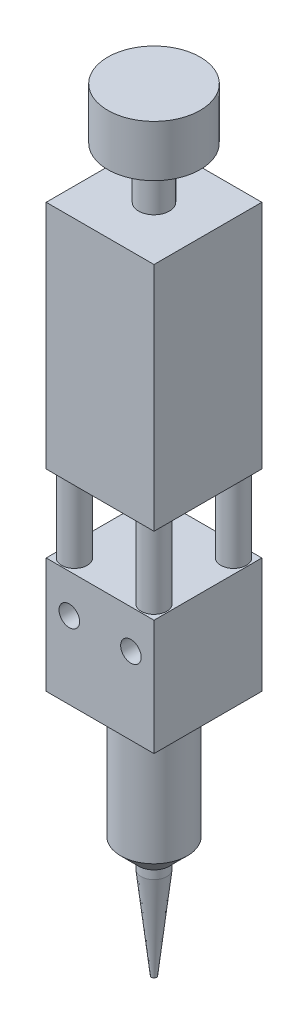
ISO-10303-21;
HEADER;
FILE_DESCRIPTION(('STEP AP214'),'2;1');
FILE_NAME('part.step','',(''),(''),'','','');
FILE_SCHEMA(('AUTOMOTIVE_DESIGN { 1 0 10303 214 1 1 1 1 }'));
ENDSEC;
DATA;
#1=APPLICATION_CONTEXT('core data for automotive mechanical design processes');
#2=APPLICATION_PROTOCOL_DEFINITION('international standard','automotive_design',2000,#1);
#3=PRODUCT_CONTEXT('',#1,'mechanical');
#4=PRODUCT('Part','Part','',(#3));
#5=PRODUCT_RELATED_PRODUCT_CATEGORY('part','',(#4));
#6=PRODUCT_DEFINITION_FORMATION('','',#4);
#7=PRODUCT_DEFINITION_CONTEXT('part definition',#1,'design');
#8=PRODUCT_DEFINITION('design','',#6,#7);
#9=PRODUCT_DEFINITION_SHAPE('','',#8);
#10=(LENGTH_UNIT() NAMED_UNIT(*) SI_UNIT(.MILLI.,.METRE.));
#11=(NAMED_UNIT(*) PLANE_ANGLE_UNIT() SI_UNIT($,.RADIAN.));
#12=(NAMED_UNIT(*) SI_UNIT($,.STERADIAN.) SOLID_ANGLE_UNIT());
#13=UNCERTAINTY_MEASURE_WITH_UNIT(LENGTH_MEASURE(1.E-05),#10,'distance_accuracy_value','');
#14=(GEOMETRIC_REPRESENTATION_CONTEXT(3) GLOBAL_UNCERTAINTY_ASSIGNED_CONTEXT((#13)) GLOBAL_UNIT_ASSIGNED_CONTEXT((#10,
#11,#12)) REPRESENTATION_CONTEXT('',''));
#15=CARTESIAN_POINT('',(0.,0.,0.));
#16=DIRECTION('',(0.,0.,1.));
#17=DIRECTION('',(1.,0.,0.));
#18=AXIS2_PLACEMENT_3D('',#15,#16,#17);
#19=CARTESIAN_POINT('',(10.5,22.5,-10.5));
#20=DIRECTION('',(-1.,0.,0.));
#21=DIRECTION('',(0.,0.,1.));
#22=AXIS2_PLACEMENT_3D('',#19,#20,#21);
#23=PLANE('',#22);
#24=DIRECTION('',(0.,0.,-1.));
#25=VECTOR('',#24,1.);
#26=CARTESIAN_POINT('',(10.5,0.,-10.5));
#27=LINE('',#26,#25);
#28=CARTESIAN_POINT('',(10.5,0.,10.5));
#29=VERTEX_POINT('',#28);
#30=CARTESIAN_POINT('',(10.5,0.,-10.5));
#31=VERTEX_POINT('',#30);
#32=EDGE_CURVE('E223',#29,#31,#27,.T.);
#33=ORIENTED_EDGE('',*,*,#32,.T.);
#34=DIRECTION('',(0.,-1.,0.));
#35=VECTOR('',#34,1.);
#36=CARTESIAN_POINT('',(10.5,22.5,-10.5));
#37=LINE('',#36,#35);
#38=CARTESIAN_POINT('',(10.5,22.5,-10.5));
#39=VERTEX_POINT('',#38);
#40=EDGE_CURVE('E42',#39,#31,#37,.T.);
#41=ORIENTED_EDGE('',*,*,#40,.F.);
#42=DIRECTION('',(0.,0.,-1.));
#43=VECTOR('',#42,1.);
#44=CARTESIAN_POINT('',(10.5,22.5,-10.5));
#45=LINE('',#44,#43);
#46=CARTESIAN_POINT('',(10.5,22.5,10.5));
#47=VERTEX_POINT('',#46);
#48=EDGE_CURVE('E227',#47,#39,#45,.T.);
#49=ORIENTED_EDGE('',*,*,#48,.F.);
#50=DIRECTION('',(0.,-1.,0.));
#51=VECTOR('',#50,1.);
#52=CARTESIAN_POINT('',(10.5,22.5,10.5));
#53=LINE('',#52,#51);
#54=EDGE_CURVE('E237',#47,#29,#53,.T.);
#55=ORIENTED_EDGE('',*,*,#54,.T.);
#56=EDGE_LOOP('',(#33,#41,#49,#55));
#57=FACE_BOUND('',#56,.T.);
#58=ADVANCED_FACE('F39',(#57),#23,.F.);
#59=CARTESIAN_POINT('',(-10.5,22.5,-10.5));
#60=DIRECTION('',(0.,0.,1.));
#61=DIRECTION('',(1.,0.,0.));
#62=AXIS2_PLACEMENT_3D('',#59,#60,#61);
#63=PLANE('',#62);
#64=CARTESIAN_POINT('',(-6.,15.,-10.5));
#65=DIRECTION('',(0.,0.,1.));
#66=DIRECTION('',(1.,0.,0.));
#67=AXIS2_PLACEMENT_3D('',#64,#65,#66);
#68=CIRCLE('',#67,1.99999999999999);
#69=CARTESIAN_POINT('',(-4.00000000000001,15.,-10.5));
#70=VERTEX_POINT('',#69);
#71=EDGE_CURVE('E203',#70,#70,#68,.T.);
#72=ORIENTED_EDGE('',*,*,#71,.T.);
#73=EDGE_LOOP('',(#72));
#74=FACE_BOUND('',#73,.T.);
#75=CARTESIAN_POINT('',(6.,15.,-10.5));
#76=DIRECTION('',(0.,0.,1.));
#77=DIRECTION('',(1.,0.,0.));
#78=AXIS2_PLACEMENT_3D('',#75,#76,#77);
#79=CIRCLE('',#78,1.99999999999999);
#80=CARTESIAN_POINT('',(7.99999999999999,15.,-10.5));
#81=VERTEX_POINT('',#80);
#82=EDGE_CURVE('E211',#81,#81,#79,.T.);
#83=ORIENTED_EDGE('',*,*,#82,.T.);
#84=EDGE_LOOP('',(#83));
#85=FACE_BOUND('',#84,.T.);
#86=DIRECTION('',(-1.,0.,0.));
#87=VECTOR('',#86,1.);
#88=CARTESIAN_POINT('',(-10.5,0.,-10.5));
#89=LINE('',#88,#87);
#90=CARTESIAN_POINT('',(-10.5,0.,-10.5));
#91=VERTEX_POINT('',#90);
#92=EDGE_CURVE('E241',#31,#91,#89,.T.);
#93=ORIENTED_EDGE('',*,*,#92,.T.);
#94=DIRECTION('',(0.,-1.,0.));
#95=VECTOR('',#94,1.);
#96=CARTESIAN_POINT('',(-10.5,22.5,-10.5));
#97=LINE('',#96,#95);
#98=CARTESIAN_POINT('',(-10.5,22.5,-10.5));
#99=VERTEX_POINT('',#98);
#100=EDGE_CURVE('E252',#99,#91,#97,.T.);
#101=ORIENTED_EDGE('',*,*,#100,.F.);
#102=DIRECTION('',(-1.,0.,0.));
#103=VECTOR('',#102,1.);
#104=CARTESIAN_POINT('',(-10.5,22.5,-10.5));
#105=LINE('',#104,#103);
#106=EDGE_CURVE('E90',#39,#99,#105,.T.);
#107=ORIENTED_EDGE('',*,*,#106,.F.);
#108=ORIENTED_EDGE('',*,*,#40,.T.);
#109=EDGE_LOOP('',(#93,#101,#107,#108));
#110=FACE_BOUND('',#109,.T.);
#111=ADVANCED_FACE('F257',(#74,#85,#110),#63,.F.);
#112=CARTESIAN_POINT('',(-10.5,22.5,-10.5));
#113=DIRECTION('',(1.,0.,0.));
#114=DIRECTION('',(0.,0.,-1.));
#115=AXIS2_PLACEMENT_3D('',#112,#113,#114);
#116=PLANE('',#115);
#117=DIRECTION('',(0.,0.,1.));
#118=VECTOR('',#117,1.);
#119=CARTESIAN_POINT('',(-10.5,0.,-10.5));
#120=LINE('',#119,#118);
#121=CARTESIAN_POINT('',(-10.5,0.,10.5));
#122=VERTEX_POINT('',#121);
#123=EDGE_CURVE('E76',#91,#122,#120,.T.);
#124=ORIENTED_EDGE('',*,*,#123,.T.);
#125=DIRECTION('',(0.,-1.,0.));
#126=VECTOR('',#125,1.);
#127=CARTESIAN_POINT('',(-10.5,22.5,10.5));
#128=LINE('',#127,#126);
#129=CARTESIAN_POINT('',(-10.5,22.5,10.5));
#130=VERTEX_POINT('',#129);
#131=EDGE_CURVE('E250',#130,#122,#128,.T.);
#132=ORIENTED_EDGE('',*,*,#131,.F.);
#133=DIRECTION('',(0.,0.,1.));
#134=VECTOR('',#133,1.);
#135=CARTESIAN_POINT('',(-10.5,22.5,-10.5));
#136=LINE('',#135,#134);
#137=EDGE_CURVE('E232',#99,#130,#136,.T.);
#138=ORIENTED_EDGE('',*,*,#137,.F.);
#139=ORIENTED_EDGE('',*,*,#100,.T.);
#140=EDGE_LOOP('',(#124,#132,#138,#139));
#141=FACE_BOUND('',#140,.T.);
#142=ADVANCED_FACE('F284',(#141),#116,.F.);
#143=CARTESIAN_POINT('',(-10.5,22.5,10.5));
#144=DIRECTION('',(0.,0.,-1.));
#145=DIRECTION('',(-1.,0.,0.));
#146=AXIS2_PLACEMENT_3D('',#143,#144,#145);
#147=PLANE('',#146);
#148=CARTESIAN_POINT('',(-6.,15.,10.5));
#149=DIRECTION('',(0.,0.,1.));
#150=DIRECTION('',(1.,0.,0.));
#151=AXIS2_PLACEMENT_3D('',#148,#149,#150);
#152=CIRCLE('',#151,2.);
#153=CARTESIAN_POINT('',(-4.,15.,10.5));
#154=VERTEX_POINT('',#153);
#155=EDGE_CURVE('E199',#154,#154,#152,.T.);
#156=ORIENTED_EDGE('',*,*,#155,.F.);
#157=EDGE_LOOP('',(#156));
#158=FACE_BOUND('',#157,.T.);
#159=CARTESIAN_POINT('',(6.,15.,10.5));
#160=DIRECTION('',(0.,0.,1.));
#161=DIRECTION('',(1.,0.,0.));
#162=AXIS2_PLACEMENT_3D('',#159,#160,#161);
#163=CIRCLE('',#162,2.);
#164=CARTESIAN_POINT('',(8.,15.,10.5));
#165=VERTEX_POINT('',#164);
#166=EDGE_CURVE('E207',#165,#165,#163,.T.);
#167=ORIENTED_EDGE('',*,*,#166,.F.);
#168=EDGE_LOOP('',(#167));
#169=FACE_BOUND('',#168,.T.);
#170=DIRECTION('',(1.,0.,0.));
#171=VECTOR('',#170,1.);
#172=CARTESIAN_POINT('',(-10.5,0.,10.5));
#173=LINE('',#172,#171);
#174=EDGE_CURVE('E82',#122,#29,#173,.T.);
#175=ORIENTED_EDGE('',*,*,#174,.T.);
#176=ORIENTED_EDGE('',*,*,#54,.F.);
#177=DIRECTION('',(1.,0.,0.));
#178=VECTOR('',#177,1.);
#179=CARTESIAN_POINT('',(-10.5,22.5,10.5));
#180=LINE('',#179,#178);
#181=EDGE_CURVE('E58',#130,#47,#180,.T.);
#182=ORIENTED_EDGE('',*,*,#181,.F.);
#183=ORIENTED_EDGE('',*,*,#131,.T.);
#184=EDGE_LOOP('',(#175,#176,#182,#183));
#185=FACE_BOUND('',#184,.T.);
#186=ADVANCED_FACE('F275',(#158,#169,#185),#147,.F.);
#187=CARTESIAN_POINT('',(0.,22.5,0.));
#188=DIRECTION('',(0.,1.,0.));
#189=DIRECTION('',(0.,0.,1.));
#190=AXIS2_PLACEMENT_3D('',#187,#188,#189);
#191=PLANE('',#190);
#192=CARTESIAN_POINT('',(-7.75000000000001,22.5,7.75));
#193=DIRECTION('',(0.,1.,0.));
#194=DIRECTION('',(0.,0.,1.));
#195=AXIS2_PLACEMENT_3D('',#192,#193,#194);
#196=CIRCLE('',#195,2.5);
#197=CARTESIAN_POINT('',(-7.75000000000001,22.5,10.25));
#198=VERTEX_POINT('',#197);
#199=EDGE_CURVE('E145',#198,#198,#196,.T.);
#200=ORIENTED_EDGE('',*,*,#199,.F.);
#201=EDGE_LOOP('',(#200));
#202=FACE_BOUND('',#201,.T.);
#203=CARTESIAN_POINT('',(7.75,22.5,7.75));
#204=DIRECTION('',(0.,1.,0.));
#205=DIRECTION('',(0.,0.,1.));
#206=AXIS2_PLACEMENT_3D('',#203,#204,#205);
#207=CIRCLE('',#206,2.5);
#208=CARTESIAN_POINT('',(7.75,22.5,10.25));
#209=VERTEX_POINT('',#208);
#210=EDGE_CURVE('E158',#209,#209,#207,.T.);
#211=ORIENTED_EDGE('',*,*,#210,.F.);
#212=EDGE_LOOP('',(#211));
#213=FACE_BOUND('',#212,.T.);
#214=CARTESIAN_POINT('',(7.75,22.5,-7.75));
#215=DIRECTION('',(0.,1.,0.));
#216=DIRECTION('',(0.,0.,1.));
#217=AXIS2_PLACEMENT_3D('',#214,#215,#216);
#218=CIRCLE('',#217,2.5);
#219=CARTESIAN_POINT('',(7.75,22.5,-5.25));
#220=VERTEX_POINT('',#219);
#221=EDGE_CURVE('E164',#220,#220,#218,.T.);
#222=ORIENTED_EDGE('',*,*,#221,.F.);
#223=EDGE_LOOP('',(#222));
#224=FACE_BOUND('',#223,.T.);
#225=CARTESIAN_POINT('',(-7.75000000000001,22.5,-7.75));
#226=DIRECTION('',(0.,1.,0.));
#227=DIRECTION('',(0.,0.,1.));
#228=AXIS2_PLACEMENT_3D('',#225,#226,#227);
#229=CIRCLE('',#228,2.5);
#230=CARTESIAN_POINT('',(-7.75000000000001,22.5,-5.25));
#231=VERTEX_POINT('',#230);
#232=EDGE_CURVE('E172',#231,#231,#229,.T.);
#233=ORIENTED_EDGE('',*,*,#232,.F.);
#234=EDGE_LOOP('',(#233));
#235=FACE_BOUND('',#234,.T.);
#236=ORIENTED_EDGE('',*,*,#48,.T.);
#237=ORIENTED_EDGE('',*,*,#106,.T.);
#238=ORIENTED_EDGE('',*,*,#137,.T.);
#239=ORIENTED_EDGE('',*,*,#181,.T.);
#240=EDGE_LOOP('',(#236,#237,#238,#239));
#241=FACE_BOUND('',#240,.T.);
#242=ADVANCED_FACE('F265',(#202,#213,#224,#235,#241),#191,.T.);
#243=CARTESIAN_POINT('',(0.,0.,0.));
#244=DIRECTION('',(0.,1.,0.));
#245=DIRECTION('',(0.,0.,1.));
#246=AXIS2_PLACEMENT_3D('',#243,#244,#245);
#247=PLANE('',#246);
#248=CARTESIAN_POINT('',(0.,0.,0.));
#249=DIRECTION('',(0.,-1.,0.));
#250=DIRECTION('',(0.,0.,-1.));
#251=AXIS2_PLACEMENT_3D('',#248,#249,#250);
#252=CIRCLE('',#251,6.5);
#253=CARTESIAN_POINT('',(0.,0.,-6.5));
#254=VERTEX_POINT('',#253);
#255=EDGE_CURVE('E49',#254,#254,#252,.T.);
#256=ORIENTED_EDGE('',*,*,#255,.F.);
#257=EDGE_LOOP('',(#256));
#258=FACE_BOUND('',#257,.T.);
#259=ORIENTED_EDGE('',*,*,#32,.F.);
#260=ORIENTED_EDGE('',*,*,#174,.F.);
#261=ORIENTED_EDGE('',*,*,#123,.F.);
#262=ORIENTED_EDGE('',*,*,#92,.F.);
#263=EDGE_LOOP('',(#259,#260,#261,#262));
#264=FACE_BOUND('',#263,.T.);
#265=ADVANCED_FACE('F262',(#258,#264),#247,.F.);
#266=CARTESIAN_POINT('',(0.,-28.,0.));
#267=DIRECTION('',(0.,-1.,0.));
#268=DIRECTION('',(0.,0.,-1.));
#269=AXIS2_PLACEMENT_3D('',#266,#267,#268);
#270=CYLINDRICAL_SURFACE('',#269,6.5);
#271=ORIENTED_EDGE('',*,*,#255,.T.);
#272=EDGE_LOOP('',(#271));
#273=FACE_BOUND('',#272,.T.);
#274=CARTESIAN_POINT('',(0.,-24.5,0.));
#275=DIRECTION('',(0.,-1.,0.));
#276=DIRECTION('',(0.,0.,-1.));
#277=AXIS2_PLACEMENT_3D('',#274,#275,#276);
#278=CIRCLE('',#277,6.5);
#279=CARTESIAN_POINT('',(0.,-24.5,-6.5));
#280=VERTEX_POINT('',#279);
#281=EDGE_CURVE('E219',#280,#280,#278,.T.);
#282=ORIENTED_EDGE('',*,*,#281,.F.);
#283=EDGE_LOOP('',(#282));
#284=FACE_BOUND('',#283,.T.);
#285=ADVANCED_FACE('F264',(#273,#284),#270,.T.);
#286=CARTESIAN_POINT('',(0.,-28.,0.));
#287=DIRECTION('',(0.,1.,0.));
#288=DIRECTION('',(0.,0.,1.));
#289=AXIS2_PLACEMENT_3D('',#286,#287,#288);
#290=CONICAL_SURFACE('',#289,3.,0.78539816339745);
#291=ORIENTED_EDGE('',*,*,#281,.T.);
#292=EDGE_LOOP('',(#291));
#293=FACE_BOUND('',#292,.T.);
#294=CARTESIAN_POINT('',(0.,-28.,0.));
#295=DIRECTION('',(0.,-1.,0.));
#296=DIRECTION('',(0.,0.,-1.));
#297=AXIS2_PLACEMENT_3D('',#294,#295,#296);
#298=CIRCLE('',#297,3.);
#299=CARTESIAN_POINT('',(0.,-28.,-3.));
#300=VERTEX_POINT('',#299);
#301=EDGE_CURVE('E215',#300,#300,#298,.T.);
#302=ORIENTED_EDGE('',*,*,#301,.F.);
#303=EDGE_LOOP('',(#302));
#304=FACE_BOUND('',#303,.T.);
#305=ADVANCED_FACE('F272',(#293,#304),#290,.T.);
#306=CARTESIAN_POINT('',(3.,-28.,0.));
#307=DIRECTION('',(0.,-1.,0.));
#308=DIRECTION('',(0.,0.,-1.));
#309=AXIS2_PLACEMENT_3D('',#306,#307,#308);
#310=PLANE('',#309);
#311=CARTESIAN_POINT('',(0.,-28.,0.));
#312=DIRECTION('',(0.,1.,0.));
#313=DIRECTION('',(0.,0.,1.));
#314=AXIS2_PLACEMENT_3D('',#311,#312,#313);
#315=CIRCLE('',#314,2.5);
#316=CARTESIAN_POINT('',(0.,-28.,2.5));
#317=VERTEX_POINT('',#316);
#318=EDGE_CURVE('E180',#317,#317,#315,.T.);
#319=ORIENTED_EDGE('',*,*,#318,.T.);
#320=EDGE_LOOP('',(#319));
#321=FACE_BOUND('',#320,.T.);
#322=ORIENTED_EDGE('',*,*,#301,.T.);
#323=EDGE_LOOP('',(#322));
#324=FACE_BOUND('',#323,.T.);
#325=ADVANCED_FACE('F302',(#321,#324),#310,.T.);
#326=CARTESIAN_POINT('',(6.,15.,10.5));
#327=DIRECTION('',(0.,0.,1.));
#328=DIRECTION('',(1.,0.,0.));
#329=AXIS2_PLACEMENT_3D('',#326,#327,#328);
#330=CYLINDRICAL_SURFACE('',#329,2.);
#331=ORIENTED_EDGE('',*,*,#82,.F.);
#332=EDGE_LOOP('',(#331));
#333=FACE_BOUND('',#332,.T.);
#334=ORIENTED_EDGE('',*,*,#166,.T.);
#335=EDGE_LOOP('',(#334));
#336=FACE_BOUND('',#335,.T.);
#337=ADVANCED_FACE('F299',(#333,#336),#330,.F.);
#338=CARTESIAN_POINT('',(-6.,15.,10.5));
#339=DIRECTION('',(0.,0.,1.));
#340=DIRECTION('',(1.,0.,0.));
#341=AXIS2_PLACEMENT_3D('',#338,#339,#340);
#342=CYLINDRICAL_SURFACE('',#341,2.);
#343=ORIENTED_EDGE('',*,*,#71,.F.);
#344=EDGE_LOOP('',(#343));
#345=FACE_BOUND('',#344,.T.);
#346=ORIENTED_EDGE('',*,*,#155,.T.);
#347=EDGE_LOOP('',(#346));
#348=FACE_BOUND('',#347,.T.);
#349=ADVANCED_FACE('F301',(#345,#348),#342,.F.);
#350=CARTESIAN_POINT('',(0.,-28.,0.));
#351=DIRECTION('',(0.,1.,0.));
#352=DIRECTION('',(0.,0.,1.));
#353=AXIS2_PLACEMENT_3D('',#350,#351,#352);
#354=CYLINDRICAL_SURFACE('',#353,0.250000000000001);
#355=CARTESIAN_POINT('',(0.,-48.,0.));
#356=DIRECTION('',(0.,1.,0.));
#357=DIRECTION('',(0.,0.,1.));
#358=AXIS2_PLACEMENT_3D('',#355,#356,#357);
#359=CIRCLE('',#358,0.250000000000002);
#360=CARTESIAN_POINT('',(0.,-48.,0.250000000000002));
#361=VERTEX_POINT('',#360);
#362=EDGE_CURVE('E195',#361,#361,#359,.T.);
#363=ORIENTED_EDGE('',*,*,#362,.F.);
#364=EDGE_LOOP('',(#363));
#365=FACE_BOUND('',#364,.T.);
#366=CARTESIAN_POINT('',(0.,-28.,0.));
#367=DIRECTION('',(0.,1.,0.));
#368=DIRECTION('',(0.,0.,1.));
#369=AXIS2_PLACEMENT_3D('',#366,#367,#368);
#370=CIRCLE('',#369,0.25);
#371=CARTESIAN_POINT('',(0.,-28.,0.25));
#372=VERTEX_POINT('',#371);
#373=EDGE_CURVE('E11',#372,#372,#370,.T.);
#374=ORIENTED_EDGE('',*,*,#373,.T.);
#375=EDGE_LOOP('',(#374));
#376=FACE_BOUND('',#375,.T.);
#377=ADVANCED_FACE('F309',(#365,#376),#354,.F.);
#378=CARTESIAN_POINT('',(0.250000000000002,-48.,0.));
#379=DIRECTION('',(0.,1.,0.));
#380=DIRECTION('',(0.,0.,1.));
#381=AXIS2_PLACEMENT_3D('',#378,#379,#380);
#382=PLANE('',#381);
#383=CARTESIAN_POINT('',(0.,-48.,0.));
#384=DIRECTION('',(0.,1.,0.));
#385=DIRECTION('',(0.,0.,1.));
#386=AXIS2_PLACEMENT_3D('',#383,#384,#385);
#387=CIRCLE('',#386,0.500000000000003);
#388=CARTESIAN_POINT('',(0.,-48.,0.500000000000002));
#389=VERTEX_POINT('',#388);
#390=EDGE_CURVE('E191',#389,#389,#387,.T.);
#391=ORIENTED_EDGE('',*,*,#390,.F.);
#392=EDGE_LOOP('',(#391));
#393=FACE_BOUND('',#392,.T.);
#394=ORIENTED_EDGE('',*,*,#362,.T.);
#395=EDGE_LOOP('',(#394));
#396=FACE_BOUND('',#395,.T.);
#397=ADVANCED_FACE('F346',(#393,#396),#382,.F.);
#398=CARTESIAN_POINT('',(0.,-48.,0.));
#399=DIRECTION('',(0.,1.,0.));
#400=DIRECTION('',(0.,0.,1.));
#401=AXIS2_PLACEMENT_3D('',#398,#399,#400);
#402=CONICAL_SURFACE('',#401,0.500000000000003,0.110657221173896);
#403=CARTESIAN_POINT('',(0.,-30.,0.));
#404=DIRECTION('',(0.,1.,0.));
#405=DIRECTION('',(0.,0.,1.));
#406=AXIS2_PLACEMENT_3D('',#403,#404,#405);
#407=CIRCLE('',#406,2.5);
#408=CARTESIAN_POINT('',(0.,-30.,2.5));
#409=VERTEX_POINT('',#408);
#410=EDGE_CURVE('E187',#409,#409,#407,.T.);
#411=CARTESIAN_POINT('',(0.,-30.,2.5));
#412=CARTESIAN_POINT('',(0.,-30.1875,2.47916666666667));
#413=CARTESIAN_POINT('',(0.,-30.375,2.45833333333333));
#414=CARTESIAN_POINT('',(0.,-30.75,2.41666666666667));
#415=CARTESIAN_POINT('',(0.,-30.9375,2.39583333333333));
#416=CARTESIAN_POINT('',(0.,-31.3125,2.35416666666667));
#417=CARTESIAN_POINT('',(0.,-31.5,2.33333333333333));
#418=CARTESIAN_POINT('',(0.,-31.875,2.29166666666667));
#419=CARTESIAN_POINT('',(0.,-32.0625,2.27083333333333));
#420=CARTESIAN_POINT('',(0.,-32.4375,2.22916666666667));
#421=CARTESIAN_POINT('',(0.,-32.625,2.20833333333333));
#422=CARTESIAN_POINT('',(0.,-33.,2.16666666666667));
#423=CARTESIAN_POINT('',(0.,-33.1875,2.14583333333333));
#424=CARTESIAN_POINT('',(0.,-33.5625,2.10416666666667));
#425=CARTESIAN_POINT('',(0.,-33.75,2.08333333333333));
#426=CARTESIAN_POINT('',(0.,-34.125,2.04166666666667));
#427=CARTESIAN_POINT('',(0.,-34.3125,2.02083333333333));
#428=CARTESIAN_POINT('',(0.,-34.6875,1.97916666666667));
#429=CARTESIAN_POINT('',(0.,-34.875,1.95833333333333));
#430=CARTESIAN_POINT('',(0.,-35.25,1.91666666666667));
#431=CARTESIAN_POINT('',(0.,-35.4375,1.89583333333333));
#432=CARTESIAN_POINT('',(0.,-35.8125,1.85416666666667));
#433=CARTESIAN_POINT('',(0.,-36.,1.83333333333333));
#434=CARTESIAN_POINT('',(0.,-36.375,1.79166666666667));
#435=CARTESIAN_POINT('',(0.,-36.5625,1.77083333333333));
#436=CARTESIAN_POINT('',(0.,-36.9375,1.72916666666667));
#437=CARTESIAN_POINT('',(0.,-37.125,1.70833333333333));
#438=CARTESIAN_POINT('',(0.,-37.5,1.66666666666667));
#439=CARTESIAN_POINT('',(0.,-37.6875,1.64583333333333));
#440=CARTESIAN_POINT('',(0.,-38.0625,1.60416666666667));
#441=CARTESIAN_POINT('',(0.,-38.25,1.58333333333333));
#442=CARTESIAN_POINT('',(0.,-38.625,1.54166666666667));
#443=CARTESIAN_POINT('',(0.,-38.8125,1.52083333333333));
#444=CARTESIAN_POINT('',(0.,-39.1875,1.47916666666667));
#445=CARTESIAN_POINT('',(0.,-39.375,1.45833333333333));
#446=CARTESIAN_POINT('',(0.,-39.75,1.41666666666667));
#447=CARTESIAN_POINT('',(0.,-39.9375,1.39583333333333));
#448=CARTESIAN_POINT('',(0.,-40.3125,1.35416666666667));
#449=CARTESIAN_POINT('',(0.,-40.5,1.33333333333334));
#450=CARTESIAN_POINT('',(0.,-40.875,1.29166666666667));
#451=CARTESIAN_POINT('',(0.,-41.0625,1.27083333333333));
#452=CARTESIAN_POINT('',(0.,-41.4375,1.22916666666667));
#453=CARTESIAN_POINT('',(0.,-41.625,1.20833333333333));
#454=CARTESIAN_POINT('',(0.,-42.,1.16666666666667));
#455=CARTESIAN_POINT('',(0.,-42.1875,1.14583333333334));
#456=CARTESIAN_POINT('',(0.,-42.5625,1.10416666666667));
#457=CARTESIAN_POINT('',(0.,-42.75,1.08333333333334));
#458=CARTESIAN_POINT('',(0.,-43.125,1.04166666666667));
#459=CARTESIAN_POINT('',(0.,-43.3125,1.02083333333334));
#460=CARTESIAN_POINT('',(0.,-43.6875,0.979166666666668));
#461=CARTESIAN_POINT('',(0.,-43.875,0.958333333333335));
#462=CARTESIAN_POINT('',(0.,-44.25,0.916666666666669));
#463=CARTESIAN_POINT('',(0.,-44.4375,0.895833333333335));
#464=CARTESIAN_POINT('',(0.,-44.8125,0.854166666666669));
#465=CARTESIAN_POINT('',(0.,-45.,0.833333333333335));
#466=CARTESIAN_POINT('',(0.,-45.375,0.791666666666669));
#467=CARTESIAN_POINT('',(0.,-45.5625,0.770833333333335));
#468=CARTESIAN_POINT('',(0.,-45.9375,0.729166666666669));
#469=CARTESIAN_POINT('',(0.,-46.125,0.708333333333335));
#470=CARTESIAN_POINT('',(0.,-46.5,0.666666666666669));
#471=CARTESIAN_POINT('',(0.,-46.6875,0.645833333333336));
#472=CARTESIAN_POINT('',(0.,-47.0625,0.604166666666669));
#473=CARTESIAN_POINT('',(0.,-47.25,0.583333333333336));
#474=CARTESIAN_POINT('',(0.,-47.625,0.541666666666668));
#475=CARTESIAN_POINT('',(0.,-47.8125,0.520833333333335));
#476=CARTESIAN_POINT('',(0.,-48.,0.500000000000002));
#477=B_SPLINE_CURVE_WITH_KNOTS('',3,(#411,#412,#413,#414,#415,#416,#417,#418,#419,#420,#421,
#422,#423,#424,#425,#426,#427,#428,#429,#430,#431,#432,#433,#434,#435,#436,#437,#438,#439,#440,
#441,#442,#443,#444,#445,#446,#447,#448,#449,#450,#451,#452,#453,#454,#455,#456,#457,#458,#459,
#460,#461,#462,#463,#464,#465,#466,#467,#468,#469,#470,#471,#472,#473,#474,#475,#476),
.UNSPECIFIED.,.F.,.F.,(4,2,2,2,2,2,2,2,2,2,2,2,2,2,2,2,2,2,2,2,2,2,2,2,2,2,2,2,2,2,2,2,4),(0.,
0.565961571133589,1.13192314226718,1.69788471340077,2.26384628453436,2.82980785566794,
3.39576942680153,3.96173099793512,4.52769256906871,5.0936541402023,5.65961571133588,
6.22557728246947,6.79153885360306,7.35750042473665,7.92346199587024,8.48942356700383,
9.05538513813742,9.621346709271,10.1873082804046,10.7532698515382,11.3192314226718,
11.8851929938054,12.4511545649389,13.0171161360725,13.5830777072061,14.1490392783397,
14.7150008494733,15.2809624206069,15.8469239917405,16.4128855628741,16.9788471340077,
17.5448087051412,18.1107702762748),.UNSPECIFIED.);
#478=EDGE_CURVE('BSEAM356',#409,#389,#477,.T.);
#479=ORIENTED_EDGE('',*,*,#410,.F.);
#480=ORIENTED_EDGE('',*,*,#390,.T.);
#481=ORIENTED_EDGE('',*,*,#478,.T.);
#482=ORIENTED_EDGE('',*,*,#478,.F.);
#483=EDGE_LOOP('',(#479,#481,#480,#482));
#484=FACE_BOUND('',#483,.T.);
#485=ADVANCED_FACE('F356',(#484),#402,.T.);
#486=CARTESIAN_POINT('',(0.,-28.,0.));
#487=DIRECTION('',(0.,1.,0.));
#488=DIRECTION('',(0.,0.,1.));
#489=AXIS2_PLACEMENT_3D('',#486,#487,#488);
#490=CYLINDRICAL_SURFACE('',#489,2.5);
#491=ORIENTED_EDGE('',*,*,#318,.F.);
#492=EDGE_LOOP('',(#491));
#493=FACE_BOUND('',#492,.T.);
#494=ORIENTED_EDGE('',*,*,#410,.T.);
#495=EDGE_LOOP('',(#494));
#496=FACE_BOUND('',#495,.T.);
#497=ADVANCED_FACE('F366',(#493,#496),#490,.T.);
#498=ORIENTED_EDGE('',*,*,#373,.F.);
#499=EDGE_LOOP('',(#498));
#500=FACE_BOUND('',#499,.T.);
#501=ADVANCED_FACE('F314',(#500),#310,.T.);
#502=CARTESIAN_POINT('',(-7.75000000000001,37.5,-7.75));
#503=DIRECTION('',(0.,-1.,0.));
#504=DIRECTION('',(0.,0.,-1.));
#505=AXIS2_PLACEMENT_3D('',#502,#503,#504);
#506=CYLINDRICAL_SURFACE('',#505,2.5);
#507=CARTESIAN_POINT('',(-7.75000000000001,37.5,-7.75));
#508=DIRECTION('',(0.,1.,0.));
#509=DIRECTION('',(0.,0.,1.));
#510=AXIS2_PLACEMENT_3D('',#507,#508,#509);
#511=CIRCLE('',#510,2.5);
#512=CARTESIAN_POINT('',(-7.75000000000001,37.5,-5.25));
#513=VERTEX_POINT('',#512);
#514=EDGE_CURVE('E176',#513,#513,#511,.T.);
#515=ORIENTED_EDGE('',*,*,#514,.F.);
#516=EDGE_LOOP('',(#515));
#517=FACE_BOUND('',#516,.T.);
#518=ORIENTED_EDGE('',*,*,#232,.T.);
#519=EDGE_LOOP('',(#518));
#520=FACE_BOUND('',#519,.T.);
#521=ADVANCED_FACE('F385',(#517,#520),#506,.T.);
#522=CARTESIAN_POINT('',(7.75,37.5,-7.75));
#523=DIRECTION('',(0.,-1.,0.));
#524=DIRECTION('',(0.,0.,-1.));
#525=AXIS2_PLACEMENT_3D('',#522,#523,#524);
#526=CYLINDRICAL_SURFACE('',#525,2.5);
#527=CARTESIAN_POINT('',(7.75,37.5,-7.75));
#528=DIRECTION('',(0.,1.,0.));
#529=DIRECTION('',(0.,0.,1.));
#530=AXIS2_PLACEMENT_3D('',#527,#528,#529);
#531=CIRCLE('',#530,2.5);
#532=CARTESIAN_POINT('',(7.75,37.5,-5.25));
#533=VERTEX_POINT('',#532);
#534=EDGE_CURVE('E168',#533,#533,#531,.T.);
#535=ORIENTED_EDGE('',*,*,#534,.F.);
#536=EDGE_LOOP('',(#535));
#537=FACE_BOUND('',#536,.T.);
#538=ORIENTED_EDGE('',*,*,#221,.T.);
#539=EDGE_LOOP('',(#538));
#540=FACE_BOUND('',#539,.T.);
#541=ADVANCED_FACE('F401',(#537,#540),#526,.T.);
#542=CARTESIAN_POINT('',(7.75,37.5,7.75));
#543=DIRECTION('',(0.,-1.,0.));
#544=DIRECTION('',(0.,0.,-1.));
#545=AXIS2_PLACEMENT_3D('',#542,#543,#544);
#546=CYLINDRICAL_SURFACE('',#545,2.5);
#547=CARTESIAN_POINT('',(7.75,37.5,7.75));
#548=DIRECTION('',(0.,1.,0.));
#549=DIRECTION('',(0.,0.,1.));
#550=AXIS2_PLACEMENT_3D('',#547,#548,#549);
#551=CIRCLE('',#550,2.5);
#552=CARTESIAN_POINT('',(7.75,37.5,10.25));
#553=VERTEX_POINT('',#552);
#554=EDGE_CURVE('E160',#553,#553,#551,.T.);
#555=ORIENTED_EDGE('',*,*,#554,.F.);
#556=EDGE_LOOP('',(#555));
#557=FACE_BOUND('',#556,.T.);
#558=ORIENTED_EDGE('',*,*,#210,.T.);
#559=EDGE_LOOP('',(#558));
#560=FACE_BOUND('',#559,.T.);
#561=ADVANCED_FACE('F411',(#557,#560),#546,.T.);
#562=CARTESIAN_POINT('',(-7.75000000000001,37.5,7.75));
#563=DIRECTION('',(0.,-1.,0.));
#564=DIRECTION('',(0.,0.,-1.));
#565=AXIS2_PLACEMENT_3D('',#562,#563,#564);
#566=CYLINDRICAL_SURFACE('',#565,2.5);
#567=CARTESIAN_POINT('',(-7.75000000000001,37.5,7.75));
#568=DIRECTION('',(0.,1.,0.));
#569=DIRECTION('',(0.,0.,1.));
#570=AXIS2_PLACEMENT_3D('',#567,#568,#569);
#571=CIRCLE('',#570,2.5);
#572=CARTESIAN_POINT('',(-7.75000000000001,37.5,10.25));
#573=VERTEX_POINT('',#572);
#574=EDGE_CURVE('E150',#573,#573,#571,.T.);
#575=ORIENTED_EDGE('',*,*,#574,.F.);
#576=EDGE_LOOP('',(#575));
#577=FACE_BOUND('',#576,.T.);
#578=ORIENTED_EDGE('',*,*,#199,.T.);
#579=EDGE_LOOP('',(#578));
#580=FACE_BOUND('',#579,.T.);
#581=ADVANCED_FACE('F421',(#577,#580),#566,.T.);
#582=CARTESIAN_POINT('',(-10.5,82.5,-10.5));
#583=DIRECTION('',(1.,0.,0.));
#584=DIRECTION('',(0.,0.,-1.));
#585=AXIS2_PLACEMENT_3D('',#582,#583,#584);
#586=PLANE('',#585);
#587=DIRECTION('',(0.,0.,1.));
#588=VECTOR('',#587,1.);
#589=CARTESIAN_POINT('',(-10.5,37.5,-10.5));
#590=LINE('',#589,#588);
#591=CARTESIAN_POINT('',(-10.5,37.5,-10.5));
#592=VERTEX_POINT('',#591);
#593=CARTESIAN_POINT('',(-10.5,37.5,10.5));
#594=VERTEX_POINT('',#593);
#595=EDGE_CURVE('E143',#592,#594,#590,.T.);
#596=ORIENTED_EDGE('',*,*,#595,.T.);
#597=DIRECTION('',(0.,-1.,0.));
#598=VECTOR('',#597,1.);
#599=CARTESIAN_POINT('',(-10.5,82.5,10.5));
#600=LINE('',#599,#598);
#601=CARTESIAN_POINT('',(-10.5,82.5,10.5));
#602=VERTEX_POINT('',#601);
#603=EDGE_CURVE('E121',#602,#594,#600,.T.);
#604=ORIENTED_EDGE('',*,*,#603,.F.);
#605=DIRECTION('',(0.,0.,1.));
#606=VECTOR('',#605,1.);
#607=CARTESIAN_POINT('',(-10.5,82.5,-10.5));
#608=LINE('',#607,#606);
#609=CARTESIAN_POINT('',(-10.5,82.5,-10.5));
#610=VERTEX_POINT('',#609);
#611=EDGE_CURVE('E129',#610,#602,#608,.T.);
#612=ORIENTED_EDGE('',*,*,#611,.F.);
#613=DIRECTION('',(0.,-1.,0.));
#614=VECTOR('',#613,1.);
#615=CARTESIAN_POINT('',(-10.5,82.5,-10.5));
#616=LINE('',#615,#614);
#617=EDGE_CURVE('E554',#610,#592,#616,.T.);
#618=ORIENTED_EDGE('',*,*,#617,.T.);
#619=EDGE_LOOP('',(#596,#604,#612,#618));
#620=FACE_BOUND('',#619,.T.);
#621=ADVANCED_FACE('F141',(#620),#586,.F.);
#622=CARTESIAN_POINT('',(-10.5,82.5,10.5));
#623=DIRECTION('',(0.,0.,-1.));
#624=DIRECTION('',(-1.,0.,0.));
#625=AXIS2_PLACEMENT_3D('',#622,#623,#624);
#626=PLANE('',#625);
#627=DIRECTION('',(1.,0.,0.));
#628=VECTOR('',#627,1.);
#629=CARTESIAN_POINT('',(-10.5,37.5,10.5));
#630=LINE('',#629,#628);
#631=CARTESIAN_POINT('',(10.5,37.5,10.5));
#632=VERTEX_POINT('',#631);
#633=EDGE_CURVE('E557',#594,#632,#630,.T.);
#634=ORIENTED_EDGE('',*,*,#633,.T.);
#635=DIRECTION('',(0.,-1.,0.));
#636=VECTOR('',#635,1.);
#637=CARTESIAN_POINT('',(10.5,82.5,10.5));
#638=LINE('',#637,#636);
#639=CARTESIAN_POINT('',(10.5,82.5,10.5));
#640=VERTEX_POINT('',#639);
#641=EDGE_CURVE('E124',#640,#632,#638,.T.);
#642=ORIENTED_EDGE('',*,*,#641,.F.);
#643=DIRECTION('',(1.,0.,0.));
#644=VECTOR('',#643,1.);
#645=CARTESIAN_POINT('',(-10.5,82.5,10.5));
#646=LINE('',#645,#644);
#647=EDGE_CURVE('E117',#602,#640,#646,.T.);
#648=ORIENTED_EDGE('',*,*,#647,.F.);
#649=ORIENTED_EDGE('',*,*,#603,.T.);
#650=EDGE_LOOP('',(#634,#642,#648,#649));
#651=FACE_BOUND('',#650,.T.);
#652=ADVANCED_FACE('F119',(#651),#626,.F.);
#653=CARTESIAN_POINT('',(10.5,82.5,-10.5));
#654=DIRECTION('',(-1.,0.,0.));
#655=DIRECTION('',(0.,0.,1.));
#656=AXIS2_PLACEMENT_3D('',#653,#654,#655);
#657=PLANE('',#656);
#658=DIRECTION('',(0.,0.,-1.));
#659=VECTOR('',#658,1.);
#660=CARTESIAN_POINT('',(10.5,37.5,-10.5));
#661=LINE('',#660,#659);
#662=CARTESIAN_POINT('',(10.5,37.5,-10.5));
#663=VERTEX_POINT('',#662);
#664=EDGE_CURVE('E560',#632,#663,#661,.T.);
#665=ORIENTED_EDGE('',*,*,#664,.T.);
#666=DIRECTION('',(0.,-1.,0.));
#667=VECTOR('',#666,1.);
#668=CARTESIAN_POINT('',(10.5,82.5,-10.5));
#669=LINE('',#668,#667);
#670=CARTESIAN_POINT('',(10.5,82.5,-10.5));
#671=VERTEX_POINT('',#670);
#672=EDGE_CURVE('E152',#671,#663,#669,.T.);
#673=ORIENTED_EDGE('',*,*,#672,.F.);
#674=DIRECTION('',(0.,0.,-1.));
#675=VECTOR('',#674,1.);
#676=CARTESIAN_POINT('',(10.5,82.5,-10.5));
#677=LINE('',#676,#675);
#678=EDGE_CURVE('E128',#640,#671,#677,.T.);
#679=ORIENTED_EDGE('',*,*,#678,.F.);
#680=ORIENTED_EDGE('',*,*,#641,.T.);
#681=EDGE_LOOP('',(#665,#673,#679,#680));
#682=FACE_BOUND('',#681,.T.);
#683=ADVANCED_FACE('F448',(#682),#657,.F.);
#684=CARTESIAN_POINT('',(-10.5,82.5,-10.5));
#685=DIRECTION('',(0.,0.,1.));
#686=DIRECTION('',(1.,0.,0.));
#687=AXIS2_PLACEMENT_3D('',#684,#685,#686);
#688=PLANE('',#687);
#689=DIRECTION('',(-1.,0.,0.));
#690=VECTOR('',#689,1.);
#691=CARTESIAN_POINT('',(-10.5,37.5,-10.5));
#692=LINE('',#691,#690);
#693=EDGE_CURVE('E139',#663,#592,#692,.T.);
#694=ORIENTED_EDGE('',*,*,#693,.T.);
#695=ORIENTED_EDGE('',*,*,#617,.F.);
#696=DIRECTION('',(-1.,0.,0.));
#697=VECTOR('',#696,1.);
#698=CARTESIAN_POINT('',(-10.5,82.5,-10.5));
#699=LINE('',#698,#697);
#700=EDGE_CURVE('E134',#671,#610,#699,.T.);
#701=ORIENTED_EDGE('',*,*,#700,.F.);
#702=ORIENTED_EDGE('',*,*,#672,.T.);
#703=EDGE_LOOP('',(#694,#695,#701,#702));
#704=FACE_BOUND('',#703,.T.);
#705=ADVANCED_FACE('F457',(#704),#688,.F.);
#706=CARTESIAN_POINT('',(0.,82.5,0.));
#707=DIRECTION('',(0.,1.,0.));
#708=DIRECTION('',(0.,0.,1.));
#709=AXIS2_PLACEMENT_3D('',#706,#707,#708);
#710=PLANE('',#709);
#711=CARTESIAN_POINT('',(0.,82.5,0.));
#712=DIRECTION('',(0.,-1.,0.));
#713=DIRECTION('',(0.,0.,-1.));
#714=AXIS2_PLACEMENT_3D('',#711,#712,#713);
#715=CIRCLE('',#714,3.);
#716=CARTESIAN_POINT('',(0.,82.5,-3.));
#717=VERTEX_POINT('',#716);
#718=EDGE_CURVE('E536',#717,#717,#715,.T.);
#719=ORIENTED_EDGE('',*,*,#718,.T.);
#720=EDGE_LOOP('',(#719));
#721=FACE_BOUND('',#720,.T.);
#722=ORIENTED_EDGE('',*,*,#611,.T.);
#723=ORIENTED_EDGE('',*,*,#647,.T.);
#724=ORIENTED_EDGE('',*,*,#678,.T.);
#725=ORIENTED_EDGE('',*,*,#700,.T.);
#726=EDGE_LOOP('',(#722,#723,#724,#725));
#727=FACE_BOUND('',#726,.T.);
#728=ADVANCED_FACE('F132',(#721,#727),#710,.T.);
#729=CARTESIAN_POINT('',(0.,37.5,0.));
#730=DIRECTION('',(0.,1.,0.));
#731=DIRECTION('',(0.,0.,1.));
#732=AXIS2_PLACEMENT_3D('',#729,#730,#731);
#733=PLANE('',#732);
#734=ORIENTED_EDGE('',*,*,#514,.T.);
#735=EDGE_LOOP('',(#734));
#736=FACE_BOUND('',#735,.T.);
#737=ORIENTED_EDGE('',*,*,#534,.T.);
#738=EDGE_LOOP('',(#737));
#739=FACE_BOUND('',#738,.T.);
#740=ORIENTED_EDGE('',*,*,#554,.T.);
#741=EDGE_LOOP('',(#740));
#742=FACE_BOUND('',#741,.T.);
#743=ORIENTED_EDGE('',*,*,#574,.T.);
#744=EDGE_LOOP('',(#743));
#745=FACE_BOUND('',#744,.T.);
#746=ORIENTED_EDGE('',*,*,#595,.F.);
#747=ORIENTED_EDGE('',*,*,#693,.F.);
#748=ORIENTED_EDGE('',*,*,#664,.F.);
#749=ORIENTED_EDGE('',*,*,#633,.F.);
#750=EDGE_LOOP('',(#746,#747,#748,#749));
#751=FACE_BOUND('',#750,.T.);
#752=ADVANCED_FACE('F474',(#736,#739,#742,#745,#751),#733,.F.);
#753=CARTESIAN_POINT('',(0.,102.5,0.));
#754=DIRECTION('',(0.,1.,0.));
#755=DIRECTION('',(0.,0.,1.));
#756=AXIS2_PLACEMENT_3D('',#753,#754,#755);
#757=PLANE('',#756);
#758=CARTESIAN_POINT('',(0.,102.5,0.));
#759=DIRECTION('',(0.,-1.,0.));
#760=DIRECTION('',(0.,0.,-1.));
#761=AXIS2_PLACEMENT_3D('',#758,#759,#760);
#762=CIRCLE('',#761,9.);
#763=CARTESIAN_POINT('',(0.,102.5,-9.));
#764=VERTEX_POINT('',#763);
#765=EDGE_CURVE('E546',#764,#764,#762,.T.);
#766=ORIENTED_EDGE('',*,*,#765,.F.);
#767=EDGE_LOOP('',(#766));
#768=FACE_BOUND('',#767,.T.);
#769=ADVANCED_FACE('F479',(#768),#757,.T.);
#770=CARTESIAN_POINT('',(0.,82.5,0.));
#771=DIRECTION('',(0.,-1.,0.));
#772=DIRECTION('',(0.,0.,-1.));
#773=AXIS2_PLACEMENT_3D('',#770,#771,#772);
#774=CYLINDRICAL_SURFACE('',#773,9.);
#775=ORIENTED_EDGE('',*,*,#765,.T.);
#776=EDGE_LOOP('',(#775));
#777=FACE_BOUND('',#776,.T.);
#778=CARTESIAN_POINT('',(0.,92.5,0.));
#779=DIRECTION('',(0.,-1.,0.));
#780=DIRECTION('',(0.,0.,-1.));
#781=AXIS2_PLACEMENT_3D('',#778,#779,#780);
#782=CIRCLE('',#781,9.);
#783=CARTESIAN_POINT('',(0.,92.5,-9.));
#784=VERTEX_POINT('',#783);
#785=EDGE_CURVE('E540',#784,#784,#782,.T.);
#786=ORIENTED_EDGE('',*,*,#785,.F.);
#787=EDGE_LOOP('',(#786));
#788=FACE_BOUND('',#787,.T.);
#789=ADVANCED_FACE('F496',(#777,#788),#774,.T.);
#790=CARTESIAN_POINT('',(9.,92.5,0.));
#791=DIRECTION('',(0.,-1.,0.));
#792=DIRECTION('',(0.,0.,-1.));
#793=AXIS2_PLACEMENT_3D('',#790,#791,#792);
#794=PLANE('',#793);
#795=ORIENTED_EDGE('',*,*,#785,.T.);
#796=EDGE_LOOP('',(#795));
#797=FACE_BOUND('',#796,.T.);
#798=CARTESIAN_POINT('',(0.,92.5,0.));
#799=DIRECTION('',(0.,-1.,0.));
#800=DIRECTION('',(0.,0.,-1.));
#801=AXIS2_PLACEMENT_3D('',#798,#799,#800);
#802=CIRCLE('',#801,3.);
#803=CARTESIAN_POINT('',(0.,92.5,-3.));
#804=VERTEX_POINT('',#803);
#805=EDGE_CURVE('E533',#804,#804,#802,.T.);
#806=ORIENTED_EDGE('',*,*,#805,.F.);
#807=EDGE_LOOP('',(#806));
#808=FACE_BOUND('',#807,.T.);
#809=ADVANCED_FACE('F506',(#797,#808),#794,.T.);
#810=CARTESIAN_POINT('',(0.,82.5,0.));
#811=DIRECTION('',(0.,-1.,0.));
#812=DIRECTION('',(0.,0.,-1.));
#813=AXIS2_PLACEMENT_3D('',#810,#811,#812);
#814=CYLINDRICAL_SURFACE('',#813,3.);
#815=ORIENTED_EDGE('',*,*,#805,.T.);
#816=EDGE_LOOP('',(#815));
#817=FACE_BOUND('',#816,.T.);
#818=ORIENTED_EDGE('',*,*,#718,.F.);
#819=EDGE_LOOP('',(#818));
#820=FACE_BOUND('',#819,.T.);
#821=ADVANCED_FACE('F516',(#817,#820),#814,.T.);
#822=CLOSED_SHELL('',(#58,#111,#142,#186,#242,#265,#285,#305,#325,#337,#349,#377,#397,#485,#497,
#501,#521,#541,#561,#581,#621,#652,#683,#705,#728,#752,#769,#789,#809,#821));
#823=MANIFOLD_SOLID_BREP('B2',#822);
#824=ADVANCED_BREP_SHAPE_REPRESENTATION('',(#18,#823),#14);
#825=SHAPE_DEFINITION_REPRESENTATION(#9,#824);
ENDSEC;
END-ISO-10303-21;
